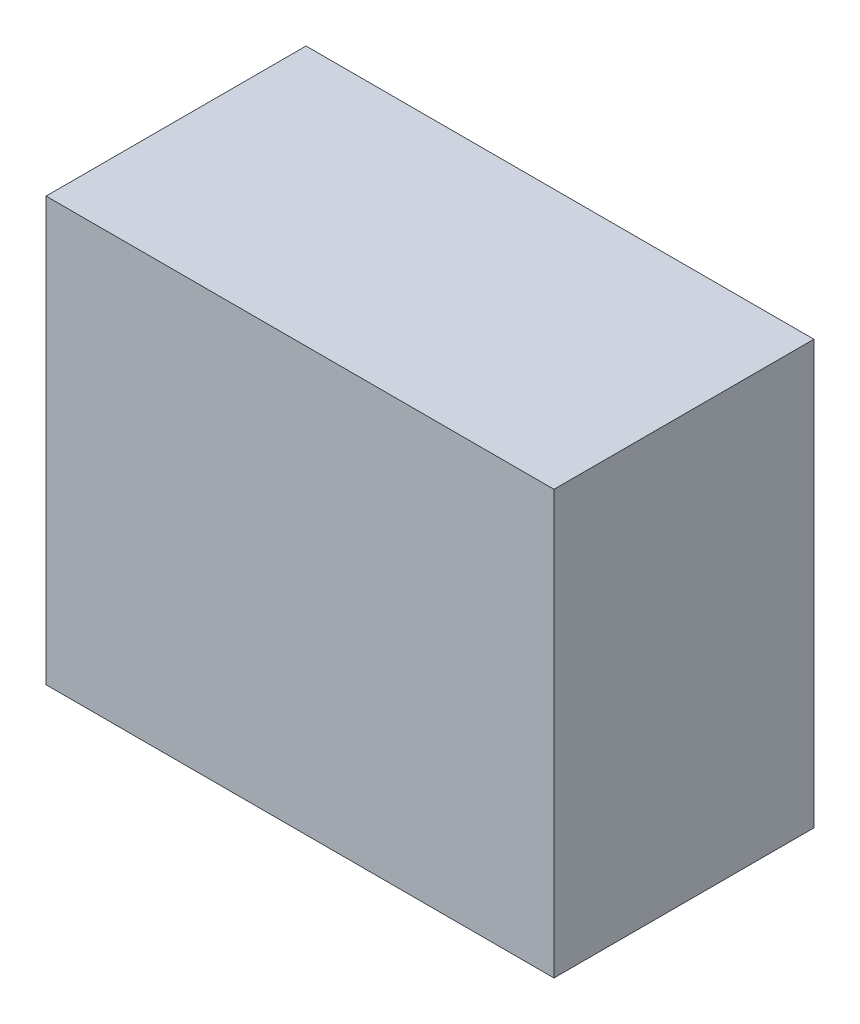
ISO-10303-21;
HEADER;
FILE_DESCRIPTION(('STEP AP214'),'2;1');
FILE_NAME('part.step','',(''),(''),'','','');
FILE_SCHEMA(('AUTOMOTIVE_DESIGN { 1 0 10303 214 1 1 1 1 }'));
ENDSEC;
DATA;
#1=APPLICATION_CONTEXT('core data for automotive mechanical design processes');
#2=APPLICATION_PROTOCOL_DEFINITION('international standard','automotive_design',2000,#1);
#3=PRODUCT_CONTEXT('',#1,'mechanical');
#4=PRODUCT('Part','Part','',(#3));
#5=PRODUCT_RELATED_PRODUCT_CATEGORY('part','',(#4));
#6=PRODUCT_DEFINITION_FORMATION('','',#4);
#7=PRODUCT_DEFINITION_CONTEXT('part definition',#1,'design');
#8=PRODUCT_DEFINITION('design','',#6,#7);
#9=PRODUCT_DEFINITION_SHAPE('','',#8);
#10=(LENGTH_UNIT() NAMED_UNIT(*) SI_UNIT(.MILLI.,.METRE.));
#11=(NAMED_UNIT(*) PLANE_ANGLE_UNIT() SI_UNIT($,.RADIAN.));
#12=(NAMED_UNIT(*) SI_UNIT($,.STERADIAN.) SOLID_ANGLE_UNIT());
#13=UNCERTAINTY_MEASURE_WITH_UNIT(LENGTH_MEASURE(1.E-05),#10,'distance_accuracy_value','');
#14=(GEOMETRIC_REPRESENTATION_CONTEXT(3) GLOBAL_UNCERTAINTY_ASSIGNED_CONTEXT((#13)) GLOBAL_UNIT_ASSIGNED_CONTEXT((#10,
#11,#12)) REPRESENTATION_CONTEXT('',''));
#15=CARTESIAN_POINT('',(0.,0.,0.));
#16=DIRECTION('',(0.,0.,1.));
#17=DIRECTION('',(1.,0.,0.));
#18=AXIS2_PLACEMENT_3D('',#15,#16,#17);
#19=CARTESIAN_POINT('',(5.08,3.81,4.));
#20=DIRECTION('',(0.,0.,-1.));
#21=DIRECTION('',(-1.,0.,0.));
#22=AXIS2_PLACEMENT_3D('',#19,#20,#21);
#23=PLANE('',#22);
#24=DIRECTION('',(0.,1.,0.));
#25=VECTOR('',#24,1.);
#26=CARTESIAN_POINT('',(-2.54,3.81,4.));
#27=LINE('',#26,#25);
#28=CARTESIAN_POINT('',(-2.54,3.81,4.));
#29=VERTEX_POINT('',#28);
#30=CARTESIAN_POINT('',(-2.54,-2.54,4.));
#31=VERTEX_POINT('',#30);
#32=EDGE_CURVE('E55',#29,#31,#27,.F.);
#33=ORIENTED_EDGE('',*,*,#32,.T.);
#34=DIRECTION('',(1.,0.,0.));
#35=VECTOR('',#34,1.);
#36=CARTESIAN_POINT('',(-2.54,-2.54,4.));
#37=LINE('',#36,#35);
#38=CARTESIAN_POINT('',(5.08,-2.54,4.));
#39=VERTEX_POINT('',#38);
#40=EDGE_CURVE('E57',#31,#39,#37,.T.);
#41=ORIENTED_EDGE('',*,*,#40,.T.);
#42=DIRECTION('',(0.,1.,0.));
#43=VECTOR('',#42,1.);
#44=CARTESIAN_POINT('',(5.08,-2.54,4.));
#45=LINE('',#44,#43);
#46=CARTESIAN_POINT('',(5.08,3.81,4.));
#47=VERTEX_POINT('',#46);
#48=EDGE_CURVE('E20',#39,#47,#45,.T.);
#49=ORIENTED_EDGE('',*,*,#48,.T.);
#50=DIRECTION('',(1.,0.,0.));
#51=VECTOR('',#50,1.);
#52=CARTESIAN_POINT('',(5.08,3.81,4.));
#53=LINE('',#52,#51);
#54=EDGE_CURVE('E80',#47,#29,#53,.F.);
#55=ORIENTED_EDGE('',*,*,#54,.T.);
#56=EDGE_LOOP('',(#33,#41,#49,#55));
#57=FACE_BOUND('',#56,.T.);
#58=ADVANCED_FACE('F17',(#57),#23,.F.);
#59=CARTESIAN_POINT('',(5.08,-2.54,0.1));
#60=DIRECTION('',(-1.,0.,0.));
#61=DIRECTION('',(0.,0.,1.));
#62=AXIS2_PLACEMENT_3D('',#59,#60,#61);
#63=PLANE('',#62);
#64=DIRECTION('',(0.,0.,-1.));
#65=VECTOR('',#64,1.);
#66=CARTESIAN_POINT('',(5.08,3.81,0.1));
#67=LINE('',#66,#65);
#68=CARTESIAN_POINT('',(5.08,3.81,0.1));
#69=VERTEX_POINT('',#68);
#70=EDGE_CURVE('E68',#69,#47,#67,.F.);
#71=ORIENTED_EDGE('',*,*,#70,.T.);
#72=ORIENTED_EDGE('',*,*,#48,.F.);
#73=DIRECTION('',(0.,0.,1.));
#74=VECTOR('',#73,1.);
#75=CARTESIAN_POINT('',(5.08,-2.54,0.1));
#76=LINE('',#75,#74);
#77=CARTESIAN_POINT('',(5.08,-2.54,0.1));
#78=VERTEX_POINT('',#77);
#79=EDGE_CURVE('E63',#39,#78,#76,.F.);
#80=ORIENTED_EDGE('',*,*,#79,.T.);
#81=DIRECTION('',(0.,1.,0.));
#82=VECTOR('',#81,1.);
#83=CARTESIAN_POINT('',(5.08,3.81,0.1));
#84=LINE('',#83,#82);
#85=EDGE_CURVE('E83',#69,#78,#84,.F.);
#86=ORIENTED_EDGE('',*,*,#85,.F.);
#87=EDGE_LOOP('',(#71,#72,#80,#86));
#88=FACE_BOUND('',#87,.T.);
#89=ADVANCED_FACE('F65',(#88),#63,.F.);
#90=CARTESIAN_POINT('',(-2.54,-2.54,0.1));
#91=DIRECTION('',(0.,1.,0.));
#92=DIRECTION('',(0.,0.,1.));
#93=AXIS2_PLACEMENT_3D('',#90,#91,#92);
#94=PLANE('',#93);
#95=ORIENTED_EDGE('',*,*,#79,.F.);
#96=ORIENTED_EDGE('',*,*,#40,.F.);
#97=DIRECTION('',(0.,0.,-1.));
#98=VECTOR('',#97,1.);
#99=CARTESIAN_POINT('',(-2.54,-2.54,0.1));
#100=LINE('',#99,#98);
#101=CARTESIAN_POINT('',(-2.54,-2.54,0.1));
#102=VERTEX_POINT('',#101);
#103=EDGE_CURVE('E75',#31,#102,#100,.T.);
#104=ORIENTED_EDGE('',*,*,#103,.T.);
#105=DIRECTION('',(-1.,0.,0.));
#106=VECTOR('',#105,1.);
#107=CARTESIAN_POINT('',(5.08,-2.54,0.1));
#108=LINE('',#107,#106);
#109=EDGE_CURVE('E72',#78,#102,#108,.T.);
#110=ORIENTED_EDGE('',*,*,#109,.F.);
#111=EDGE_LOOP('',(#95,#96,#104,#110));
#112=FACE_BOUND('',#111,.T.);
#113=ADVANCED_FACE('F70',(#112),#94,.F.);
#114=CARTESIAN_POINT('',(-2.54,3.81,0.1));
#115=DIRECTION('',(1.,0.,0.));
#116=DIRECTION('',(0.,0.,-1.));
#117=AXIS2_PLACEMENT_3D('',#114,#115,#116);
#118=PLANE('',#117);
#119=ORIENTED_EDGE('',*,*,#103,.F.);
#120=ORIENTED_EDGE('',*,*,#32,.F.);
#121=DIRECTION('',(0.,0.,-1.));
#122=VECTOR('',#121,1.);
#123=CARTESIAN_POINT('',(-2.54,3.81,0.1));
#124=LINE('',#123,#122);
#125=CARTESIAN_POINT('',(-2.54,3.81,0.1));
#126=VERTEX_POINT('',#125);
#127=EDGE_CURVE('E35',#29,#126,#124,.T.);
#128=ORIENTED_EDGE('',*,*,#127,.T.);
#129=DIRECTION('',(0.,1.,0.));
#130=VECTOR('',#129,1.);
#131=CARTESIAN_POINT('',(-2.54,3.81,0.1));
#132=LINE('',#131,#130);
#133=EDGE_CURVE('E26',#102,#126,#132,.T.);
#134=ORIENTED_EDGE('',*,*,#133,.F.);
#135=EDGE_LOOP('',(#119,#120,#128,#134));
#136=FACE_BOUND('',#135,.T.);
#137=ADVANCED_FACE('F89',(#136),#118,.F.);
#138=CARTESIAN_POINT('',(5.08,3.81,0.1));
#139=DIRECTION('',(0.,-1.,0.));
#140=DIRECTION('',(0.,0.,-1.));
#141=AXIS2_PLACEMENT_3D('',#138,#139,#140);
#142=PLANE('',#141);
#143=ORIENTED_EDGE('',*,*,#127,.F.);
#144=ORIENTED_EDGE('',*,*,#54,.F.);
#145=ORIENTED_EDGE('',*,*,#70,.F.);
#146=DIRECTION('',(-1.,0.,0.));
#147=VECTOR('',#146,1.);
#148=CARTESIAN_POINT('',(5.08,3.81,0.1));
#149=LINE('',#148,#147);
#150=EDGE_CURVE('E11',#126,#69,#149,.F.);
#151=ORIENTED_EDGE('',*,*,#150,.F.);
#152=EDGE_LOOP('',(#143,#144,#145,#151));
#153=FACE_BOUND('',#152,.T.);
#154=ADVANCED_FACE('F91',(#153),#142,.F.);
#155=CARTESIAN_POINT('',(5.08,3.81,0.1));
#156=DIRECTION('',(0.,0.,-1.));
#157=DIRECTION('',(-1.,0.,0.));
#158=AXIS2_PLACEMENT_3D('',#155,#156,#157);
#159=PLANE('',#158);
#160=ORIENTED_EDGE('',*,*,#133,.T.);
#161=ORIENTED_EDGE('',*,*,#150,.T.);
#162=ORIENTED_EDGE('',*,*,#85,.T.);
#163=ORIENTED_EDGE('',*,*,#109,.T.);
#164=EDGE_LOOP('',(#160,#161,#162,#163));
#165=FACE_BOUND('',#164,.T.);
#166=ADVANCED_FACE('F88',(#165),#159,.T.);
#167=CLOSED_SHELL('',(#58,#89,#113,#137,#154,#166));
#168=MANIFOLD_SOLID_BREP('B1',#167);
#169=ADVANCED_BREP_SHAPE_REPRESENTATION('',(#18,#168),#14);
#170=SHAPE_DEFINITION_REPRESENTATION(#9,#169);
ENDSEC;
END-ISO-10303-21;
